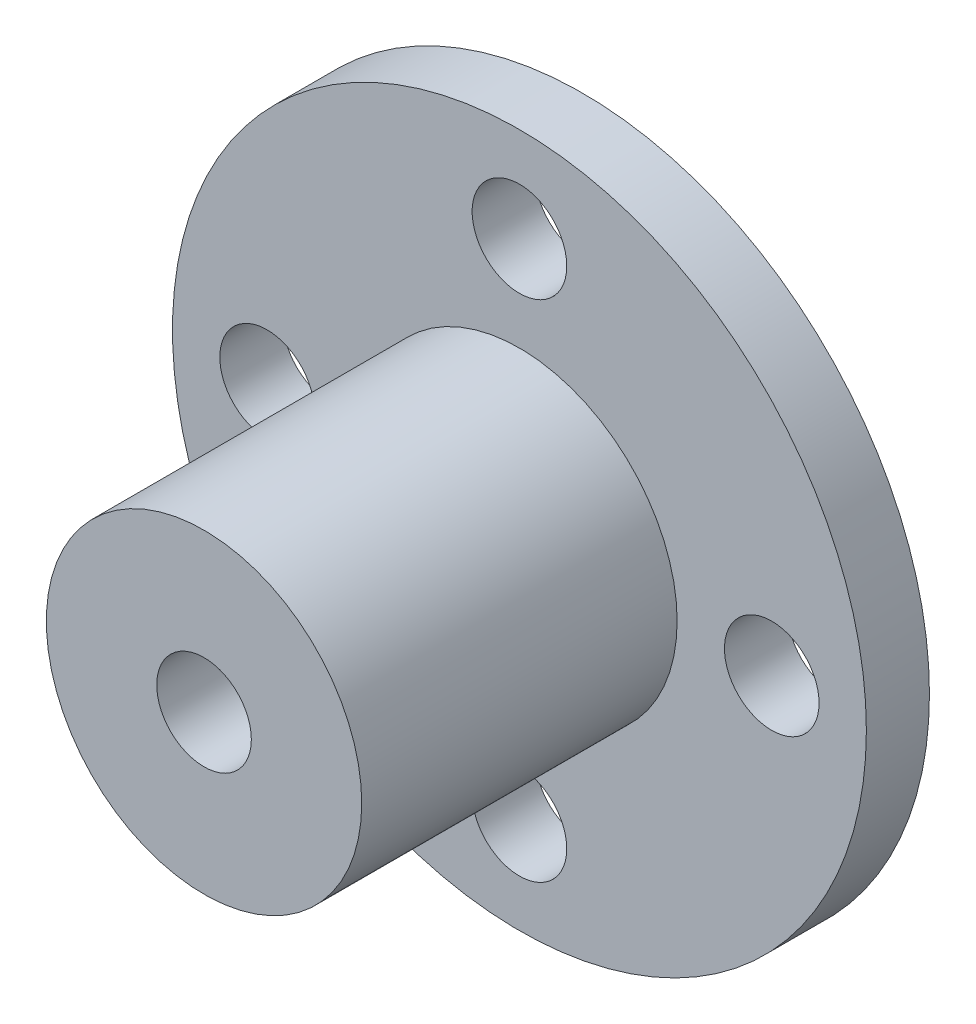
ISO-10303-21;
HEADER;
FILE_DESCRIPTION(('STEP AP214'),'2;1');
FILE_NAME('part.step','',(''),(''),'','','');
FILE_SCHEMA(('AUTOMOTIVE_DESIGN { 1 0 10303 214 1 1 1 1 }'));
ENDSEC;
DATA;
#1=APPLICATION_CONTEXT('core data for automotive mechanical design processes');
#2=APPLICATION_PROTOCOL_DEFINITION('international standard','automotive_design',2000,#1);
#3=PRODUCT_CONTEXT('',#1,'mechanical');
#4=PRODUCT('Part','Part','',(#3));
#5=PRODUCT_RELATED_PRODUCT_CATEGORY('part','',(#4));
#6=PRODUCT_DEFINITION_FORMATION('','',#4);
#7=PRODUCT_DEFINITION_CONTEXT('part definition',#1,'design');
#8=PRODUCT_DEFINITION('design','',#6,#7);
#9=PRODUCT_DEFINITION_SHAPE('','',#8);
#10=(LENGTH_UNIT() NAMED_UNIT(*) SI_UNIT(.MILLI.,.METRE.));
#11=(NAMED_UNIT(*) PLANE_ANGLE_UNIT() SI_UNIT($,.RADIAN.));
#12=(NAMED_UNIT(*) SI_UNIT($,.STERADIAN.) SOLID_ANGLE_UNIT());
#13=UNCERTAINTY_MEASURE_WITH_UNIT(LENGTH_MEASURE(1.E-05),#10,'distance_accuracy_value','');
#14=(GEOMETRIC_REPRESENTATION_CONTEXT(3) GLOBAL_UNCERTAINTY_ASSIGNED_CONTEXT((#13)) GLOBAL_UNIT_ASSIGNED_CONTEXT((#10,
#11,#12)) REPRESENTATION_CONTEXT('',''));
#15=CARTESIAN_POINT('',(0.,0.,0.));
#16=DIRECTION('',(0.,0.,1.));
#17=DIRECTION('',(1.,0.,0.));
#18=AXIS2_PLACEMENT_3D('',#15,#16,#17);
#19=CARTESIAN_POINT('',(0.,-8.,2.));
#20=DIRECTION('',(0.,0.,-1.));
#21=DIRECTION('',(-1.,0.,0.));
#22=AXIS2_PLACEMENT_3D('',#19,#20,#21);
#23=CYLINDRICAL_SURFACE('',#22,1.5);
#24=CARTESIAN_POINT('',(0.,-8.,2.));
#25=DIRECTION('',(0.,0.,1.));
#26=DIRECTION('',(1.,0.,0.));
#27=AXIS2_PLACEMENT_3D('',#24,#25,#26);
#28=CIRCLE('',#27,1.5);
#29=CARTESIAN_POINT('',(1.5,-8.,2.));
#30=VERTEX_POINT('',#29);
#31=EDGE_CURVE('E46',#30,#30,#28,.T.);
#32=ORIENTED_EDGE('',*,*,#31,.T.);
#33=EDGE_LOOP('',(#32));
#34=FACE_BOUND('',#33,.T.);
#35=CARTESIAN_POINT('',(0.,-8.,0.));
#36=DIRECTION('',(0.,0.,1.));
#37=DIRECTION('',(1.,0.,0.));
#38=AXIS2_PLACEMENT_3D('',#35,#36,#37);
#39=CIRCLE('',#38,1.5);
#40=CARTESIAN_POINT('',(1.5,-8.,0.));
#41=VERTEX_POINT('',#40);
#42=EDGE_CURVE('E68',#41,#41,#39,.T.);
#43=ORIENTED_EDGE('',*,*,#42,.F.);
#44=EDGE_LOOP('',(#43));
#45=FACE_BOUND('',#44,.T.);
#46=ADVANCED_FACE('F37',(#34,#45),#23,.F.);
#47=CARTESIAN_POINT('',(8.,0.,2.));
#48=DIRECTION('',(0.,0.,-1.));
#49=DIRECTION('',(-1.,0.,0.));
#50=AXIS2_PLACEMENT_3D('',#47,#48,#49);
#51=CYLINDRICAL_SURFACE('',#50,1.5);
#52=CARTESIAN_POINT('',(8.,0.,2.));
#53=DIRECTION('',(0.,0.,1.));
#54=DIRECTION('',(1.,0.,0.));
#55=AXIS2_PLACEMENT_3D('',#52,#53,#54);
#56=CIRCLE('',#55,1.5);
#57=CARTESIAN_POINT('',(9.5,0.,2.));
#58=VERTEX_POINT('',#57);
#59=EDGE_CURVE('E52',#58,#58,#56,.T.);
#60=ORIENTED_EDGE('',*,*,#59,.T.);
#61=EDGE_LOOP('',(#60));
#62=FACE_BOUND('',#61,.T.);
#63=CARTESIAN_POINT('',(8.,0.,0.));
#64=DIRECTION('',(0.,0.,1.));
#65=DIRECTION('',(1.,0.,0.));
#66=AXIS2_PLACEMENT_3D('',#63,#64,#65);
#67=CIRCLE('',#66,1.5);
#68=CARTESIAN_POINT('',(9.5,0.,0.));
#69=VERTEX_POINT('',#68);
#70=EDGE_CURVE('E65',#69,#69,#67,.T.);
#71=ORIENTED_EDGE('',*,*,#70,.F.);
#72=EDGE_LOOP('',(#71));
#73=FACE_BOUND('',#72,.T.);
#74=ADVANCED_FACE('F94',(#62,#73),#51,.F.);
#75=CARTESIAN_POINT('',(0.,8.,2.));
#76=DIRECTION('',(0.,0.,-1.));
#77=DIRECTION('',(-1.,0.,0.));
#78=AXIS2_PLACEMENT_3D('',#75,#76,#77);
#79=CYLINDRICAL_SURFACE('',#78,1.5);
#80=CARTESIAN_POINT('',(0.,8.,2.));
#81=DIRECTION('',(0.,0.,1.));
#82=DIRECTION('',(1.,0.,0.));
#83=AXIS2_PLACEMENT_3D('',#80,#81,#82);
#84=CIRCLE('',#83,1.5);
#85=CARTESIAN_POINT('',(1.5,8.,2.));
#86=VERTEX_POINT('',#85);
#87=EDGE_CURVE('E80',#86,#86,#84,.T.);
#88=ORIENTED_EDGE('',*,*,#87,.T.);
#89=EDGE_LOOP('',(#88));
#90=FACE_BOUND('',#89,.T.);
#91=CARTESIAN_POINT('',(0.,8.,0.));
#92=DIRECTION('',(0.,0.,1.));
#93=DIRECTION('',(1.,0.,0.));
#94=AXIS2_PLACEMENT_3D('',#91,#92,#93);
#95=CIRCLE('',#94,1.5);
#96=CARTESIAN_POINT('',(1.5,8.,0.));
#97=VERTEX_POINT('',#96);
#98=EDGE_CURVE('E60',#97,#97,#95,.T.);
#99=ORIENTED_EDGE('',*,*,#98,.F.);
#100=EDGE_LOOP('',(#99));
#101=FACE_BOUND('',#100,.T.);
#102=ADVANCED_FACE('F112',(#90,#101),#79,.F.);
#103=CARTESIAN_POINT('',(-8.,0.,2.));
#104=DIRECTION('',(0.,0.,-1.));
#105=DIRECTION('',(-1.,0.,0.));
#106=AXIS2_PLACEMENT_3D('',#103,#104,#105);
#107=CYLINDRICAL_SURFACE('',#106,1.5);
#108=CARTESIAN_POINT('',(-8.,0.,2.));
#109=DIRECTION('',(0.,0.,1.));
#110=DIRECTION('',(1.,0.,0.));
#111=AXIS2_PLACEMENT_3D('',#108,#109,#110);
#112=CIRCLE('',#111,1.5);
#113=CARTESIAN_POINT('',(-6.5,0.,2.));
#114=VERTEX_POINT('',#113);
#115=EDGE_CURVE('E75',#114,#114,#112,.T.);
#116=ORIENTED_EDGE('',*,*,#115,.T.);
#117=EDGE_LOOP('',(#116));
#118=FACE_BOUND('',#117,.T.);
#119=CARTESIAN_POINT('',(-8.,0.,0.));
#120=DIRECTION('',(0.,0.,1.));
#121=DIRECTION('',(1.,0.,0.));
#122=AXIS2_PLACEMENT_3D('',#119,#120,#121);
#123=CIRCLE('',#122,1.5);
#124=CARTESIAN_POINT('',(-6.5,0.,0.));
#125=VERTEX_POINT('',#124);
#126=EDGE_CURVE('E56',#125,#125,#123,.T.);
#127=ORIENTED_EDGE('',*,*,#126,.F.);
#128=EDGE_LOOP('',(#127));
#129=FACE_BOUND('',#128,.T.);
#130=ADVANCED_FACE('F39',(#118,#129),#107,.F.);
#131=CARTESIAN_POINT('',(0.,0.,2.));
#132=DIRECTION('',(0.,0.,-1.));
#133=DIRECTION('',(-1.,0.,0.));
#134=AXIS2_PLACEMENT_3D('',#131,#132,#133);
#135=CYLINDRICAL_SURFACE('',#134,11.);
#136=CARTESIAN_POINT('',(0.,0.,2.));
#137=DIRECTION('',(0.,0.,1.));
#138=DIRECTION('',(1.,0.,0.));
#139=AXIS2_PLACEMENT_3D('',#136,#137,#138);
#140=CIRCLE('',#139,11.);
#141=CARTESIAN_POINT('',(11.,0.,2.));
#142=VERTEX_POINT('',#141);
#143=EDGE_CURVE('E10',#142,#142,#140,.T.);
#144=ORIENTED_EDGE('',*,*,#143,.F.);
#145=EDGE_LOOP('',(#144));
#146=FACE_BOUND('',#145,.T.);
#147=CARTESIAN_POINT('',(0.,0.,0.));
#148=DIRECTION('',(0.,0.,1.));
#149=DIRECTION('',(1.,0.,0.));
#150=AXIS2_PLACEMENT_3D('',#147,#148,#149);
#151=CIRCLE('',#150,11.);
#152=CARTESIAN_POINT('',(11.,0.,0.));
#153=VERTEX_POINT('',#152);
#154=EDGE_CURVE('E41',#153,#153,#151,.T.);
#155=ORIENTED_EDGE('',*,*,#154,.T.);
#156=EDGE_LOOP('',(#155));
#157=FACE_BOUND('',#156,.T.);
#158=ADVANCED_FACE('F101',(#146,#157),#135,.T.);
#159=CARTESIAN_POINT('',(0.,0.,2.));
#160=DIRECTION('',(0.,0.,1.));
#161=DIRECTION('',(1.,0.,0.));
#162=AXIS2_PLACEMENT_3D('',#159,#160,#161);
#163=PLANE('',#162);
#164=CARTESIAN_POINT('',(0.,0.,2.));
#165=DIRECTION('',(0.,0.,1.));
#166=DIRECTION('',(1.,0.,0.));
#167=AXIS2_PLACEMENT_3D('',#164,#165,#166);
#168=CIRCLE('',#167,5.);
#169=CARTESIAN_POINT('',(5.,0.,2.));
#170=VERTEX_POINT('',#169);
#171=EDGE_CURVE('E88',#170,#170,#168,.T.);
#172=ORIENTED_EDGE('',*,*,#171,.F.);
#173=EDGE_LOOP('',(#172));
#174=FACE_BOUND('',#173,.T.);
#175=ORIENTED_EDGE('',*,*,#115,.F.);
#176=EDGE_LOOP('',(#175));
#177=FACE_BOUND('',#176,.T.);
#178=ORIENTED_EDGE('',*,*,#87,.F.);
#179=EDGE_LOOP('',(#178));
#180=FACE_BOUND('',#179,.T.);
#181=ORIENTED_EDGE('',*,*,#59,.F.);
#182=EDGE_LOOP('',(#181));
#183=FACE_BOUND('',#182,.T.);
#184=ORIENTED_EDGE('',*,*,#31,.F.);
#185=EDGE_LOOP('',(#184));
#186=FACE_BOUND('',#185,.T.);
#187=ORIENTED_EDGE('',*,*,#143,.T.);
#188=EDGE_LOOP('',(#187));
#189=FACE_BOUND('',#188,.T.);
#190=ADVANCED_FACE('F97',(#174,#177,#180,#183,#186,#189),#163,.T.);
#191=CARTESIAN_POINT('',(0.,0.,0.));
#192=DIRECTION('',(0.,0.,1.));
#193=DIRECTION('',(1.,0.,0.));
#194=AXIS2_PLACEMENT_3D('',#191,#192,#193);
#195=PLANE('',#194);
#196=CARTESIAN_POINT('',(0.,0.,0.));
#197=DIRECTION('',(0.,0.,1.));
#198=DIRECTION('',(1.,0.,0.));
#199=AXIS2_PLACEMENT_3D('',#196,#197,#198);
#200=CIRCLE('',#199,1.5);
#201=CARTESIAN_POINT('',(1.5,0.,0.));
#202=VERTEX_POINT('',#201);
#203=EDGE_CURVE('E150',#202,#202,#200,.T.);
#204=ORIENTED_EDGE('',*,*,#203,.T.);
#205=EDGE_LOOP('',(#204));
#206=FACE_BOUND('',#205,.T.);
#207=ORIENTED_EDGE('',*,*,#126,.T.);
#208=EDGE_LOOP('',(#207));
#209=FACE_BOUND('',#208,.T.);
#210=ORIENTED_EDGE('',*,*,#98,.T.);
#211=EDGE_LOOP('',(#210));
#212=FACE_BOUND('',#211,.T.);
#213=ORIENTED_EDGE('',*,*,#70,.T.);
#214=EDGE_LOOP('',(#213));
#215=FACE_BOUND('',#214,.T.);
#216=ORIENTED_EDGE('',*,*,#42,.T.);
#217=EDGE_LOOP('',(#216));
#218=FACE_BOUND('',#217,.T.);
#219=ORIENTED_EDGE('',*,*,#154,.F.);
#220=EDGE_LOOP('',(#219));
#221=FACE_BOUND('',#220,.T.);
#222=ADVANCED_FACE('F100',(#206,#209,#212,#215,#218,#221),#195,.F.);
#223=CARTESIAN_POINT('',(0.,0.,12.));
#224=DIRECTION('',(0.,0.,-1.));
#225=DIRECTION('',(-1.,0.,0.));
#226=AXIS2_PLACEMENT_3D('',#223,#224,#225);
#227=CYLINDRICAL_SURFACE('',#226,5.);
#228=CARTESIAN_POINT('',(0.,0.,12.));
#229=DIRECTION('',(0.,0.,1.));
#230=DIRECTION('',(1.,0.,0.));
#231=AXIS2_PLACEMENT_3D('',#228,#229,#230);
#232=CIRCLE('',#231,5.);
#233=CARTESIAN_POINT('',(5.,0.,12.));
#234=VERTEX_POINT('',#233);
#235=EDGE_CURVE('E61',#234,#234,#232,.T.);
#236=ORIENTED_EDGE('',*,*,#235,.F.);
#237=EDGE_LOOP('',(#236));
#238=FACE_BOUND('',#237,.T.);
#239=ORIENTED_EDGE('',*,*,#171,.T.);
#240=EDGE_LOOP('',(#239));
#241=FACE_BOUND('',#240,.T.);
#242=ADVANCED_FACE('F127',(#238,#241),#227,.T.);
#243=CARTESIAN_POINT('',(0.,0.,12.));
#244=DIRECTION('',(0.,0.,1.));
#245=DIRECTION('',(1.,0.,0.));
#246=AXIS2_PLACEMENT_3D('',#243,#244,#245);
#247=PLANE('',#246);
#248=CARTESIAN_POINT('',(0.,0.,12.));
#249=DIRECTION('',(0.,0.,1.));
#250=DIRECTION('',(1.,0.,0.));
#251=AXIS2_PLACEMENT_3D('',#248,#249,#250);
#252=CIRCLE('',#251,1.5);
#253=CARTESIAN_POINT('',(1.5,0.,12.));
#254=VERTEX_POINT('',#253);
#255=EDGE_CURVE('E153',#254,#254,#252,.T.);
#256=ORIENTED_EDGE('',*,*,#255,.F.);
#257=EDGE_LOOP('',(#256));
#258=FACE_BOUND('',#257,.T.);
#259=ORIENTED_EDGE('',*,*,#235,.T.);
#260=EDGE_LOOP('',(#259));
#261=FACE_BOUND('',#260,.T.);
#262=ADVANCED_FACE('F134',(#258,#261),#247,.T.);
#263=CARTESIAN_POINT('',(0.,0.,0.));
#264=DIRECTION('',(0.,0.,1.));
#265=DIRECTION('',(1.,0.,0.));
#266=AXIS2_PLACEMENT_3D('',#263,#264,#265);
#267=CYLINDRICAL_SURFACE('',#266,1.5);
#268=ORIENTED_EDGE('',*,*,#203,.F.);
#269=EDGE_LOOP('',(#268));
#270=FACE_BOUND('',#269,.T.);
#271=ORIENTED_EDGE('',*,*,#255,.T.);
#272=EDGE_LOOP('',(#271));
#273=FACE_BOUND('',#272,.T.);
#274=ADVANCED_FACE('F142',(#270,#273),#267,.F.);
#275=CLOSED_SHELL('',(#46,#74,#102,#130,#158,#190,#222,#242,#262,#274));
#276=MANIFOLD_SOLID_BREP('B2',#275);
#277=ADVANCED_BREP_SHAPE_REPRESENTATION('',(#18,#276),#14);
#278=SHAPE_DEFINITION_REPRESENTATION(#9,#277);
ENDSEC;
END-ISO-10303-21;
